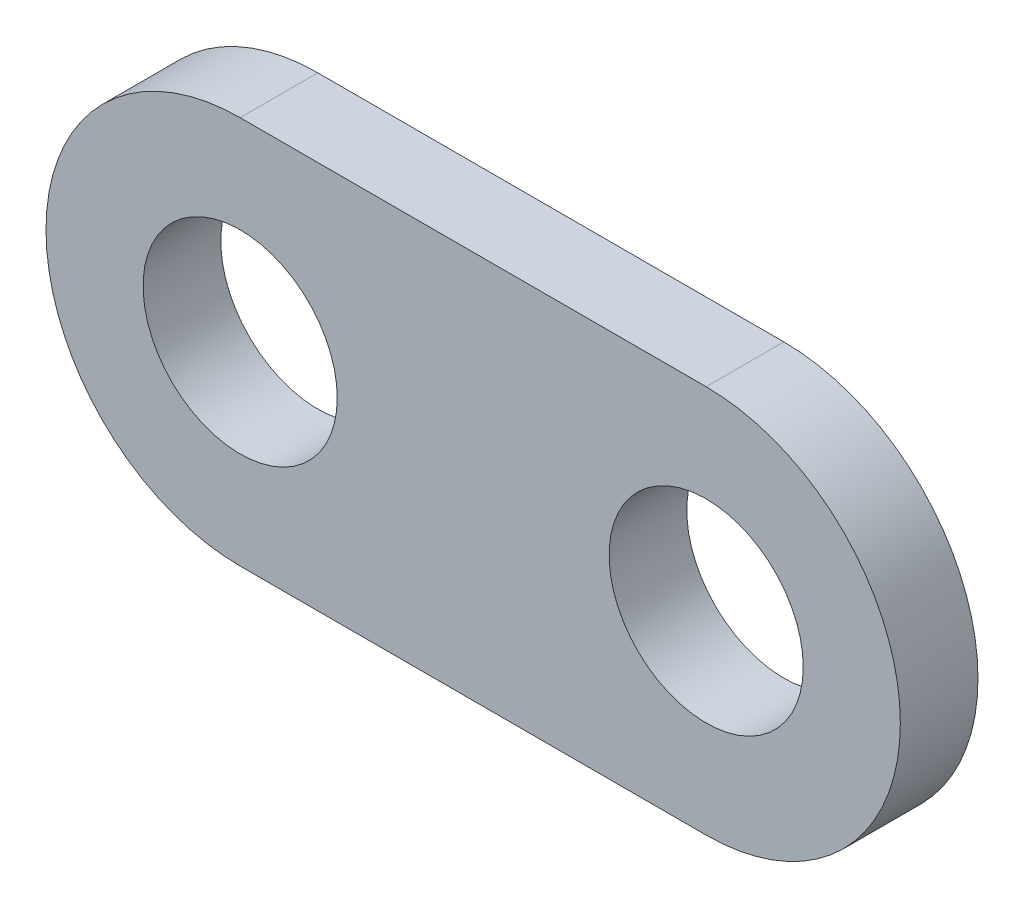
ISO-10303-21;
HEADER;
FILE_DESCRIPTION(('STEP AP214'),'2;1');
FILE_NAME('part.step','',(''),(''),'','','');
FILE_SCHEMA(('AUTOMOTIVE_DESIGN { 1 0 10303 214 1 1 1 1 }'));
ENDSEC;
DATA;
#1=APPLICATION_CONTEXT('core data for automotive mechanical design processes');
#2=APPLICATION_PROTOCOL_DEFINITION('international standard','automotive_design',2000,#1);
#3=PRODUCT_CONTEXT('',#1,'mechanical');
#4=PRODUCT('Part','Part','',(#3));
#5=PRODUCT_RELATED_PRODUCT_CATEGORY('part','',(#4));
#6=PRODUCT_DEFINITION_FORMATION('','',#4);
#7=PRODUCT_DEFINITION_CONTEXT('part definition',#1,'design');
#8=PRODUCT_DEFINITION('design','',#6,#7);
#9=PRODUCT_DEFINITION_SHAPE('','',#8);
#10=(LENGTH_UNIT() NAMED_UNIT(*) SI_UNIT(.MILLI.,.METRE.));
#11=(NAMED_UNIT(*) PLANE_ANGLE_UNIT() SI_UNIT($,.RADIAN.));
#12=(NAMED_UNIT(*) SI_UNIT($,.STERADIAN.) SOLID_ANGLE_UNIT());
#13=UNCERTAINTY_MEASURE_WITH_UNIT(LENGTH_MEASURE(1.E-05),#10,'distance_accuracy_value','');
#14=(GEOMETRIC_REPRESENTATION_CONTEXT(3) GLOBAL_UNCERTAINTY_ASSIGNED_CONTEXT((#13)) GLOBAL_UNIT_ASSIGNED_CONTEXT((#10,
#11,#12)) REPRESENTATION_CONTEXT('',''));
#15=CARTESIAN_POINT('',(0.,0.,0.));
#16=DIRECTION('',(0.,0.,1.));
#17=DIRECTION('',(1.,0.,0.));
#18=AXIS2_PLACEMENT_3D('',#15,#16,#17);
#19=CARTESIAN_POINT('',(0.,0.,2.));
#20=DIRECTION('',(0.,0.,1.));
#21=DIRECTION('',(1.,0.,0.));
#22=AXIS2_PLACEMENT_3D('',#19,#20,#21);
#23=PLANE('',#22);
#24=CARTESIAN_POINT('',(0.,0.,2.));
#25=DIRECTION('',(0.,0.,1.));
#26=DIRECTION('',(1.,0.,0.));
#27=AXIS2_PLACEMENT_3D('',#24,#25,#26);
#28=CIRCLE('',#27,5.);
#29=CARTESIAN_POINT('',(5.,0.,2.));
#30=VERTEX_POINT('',#29);
#31=EDGE_CURVE('E98',#30,#30,#28,.T.);
#32=ORIENTED_EDGE('',*,*,#31,.F.);
#33=EDGE_LOOP('',(#32));
#34=FACE_BOUND('',#33,.T.);
#35=CARTESIAN_POINT('',(0.,0.,2.));
#36=DIRECTION('',(0.,0.,1.));
#37=DIRECTION('',(1.,0.,0.));
#38=AXIS2_PLACEMENT_3D('',#35,#36,#37);
#39=CIRCLE('',#38,10.);
#40=CARTESIAN_POINT('',(0.,10.,2.));
#41=VERTEX_POINT('',#40);
#42=CARTESIAN_POINT('',(0.,-10.,2.));
#43=VERTEX_POINT('',#42);
#44=EDGE_CURVE('E108',#41,#43,#39,.T.);
#45=ORIENTED_EDGE('',*,*,#44,.T.);
#46=DIRECTION('',(1.,0.,0.));
#47=VECTOR('',#46,1.);
#48=CARTESIAN_POINT('',(24.,-10.,2.));
#49=LINE('',#48,#47);
#50=CARTESIAN_POINT('',(24.,-10.,2.));
#51=VERTEX_POINT('',#50);
#52=EDGE_CURVE('E93',#43,#51,#49,.T.);
#53=ORIENTED_EDGE('',*,*,#52,.T.);
#54=CARTESIAN_POINT('',(24.,0.,2.));
#55=DIRECTION('',(0.,0.,1.));
#56=DIRECTION('',(-1.,0.,0.));
#57=AXIS2_PLACEMENT_3D('',#54,#55,#56);
#58=CIRCLE('',#57,10.);
#59=CARTESIAN_POINT('',(24.,10.,2.));
#60=VERTEX_POINT('',#59);
#61=EDGE_CURVE('E59',#51,#60,#58,.T.);
#62=ORIENTED_EDGE('',*,*,#61,.T.);
#63=DIRECTION('',(-1.,0.,0.));
#64=VECTOR('',#63,1.);
#65=CARTESIAN_POINT('',(0.,10.,2.));
#66=LINE('',#65,#64);
#67=EDGE_CURVE('E54',#60,#41,#66,.T.);
#68=ORIENTED_EDGE('',*,*,#67,.T.);
#69=EDGE_LOOP('',(#45,#53,#62,#68));
#70=FACE_BOUND('',#69,.T.);
#71=CARTESIAN_POINT('',(24.,0.,2.));
#72=DIRECTION('',(0.,0.,1.));
#73=DIRECTION('',(1.,0.,0.));
#74=AXIS2_PLACEMENT_3D('',#71,#72,#73);
#75=CIRCLE('',#74,5.);
#76=CARTESIAN_POINT('',(29.,0.,2.));
#77=VERTEX_POINT('',#76);
#78=EDGE_CURVE('E126',#77,#77,#75,.T.);
#79=ORIENTED_EDGE('',*,*,#78,.F.);
#80=EDGE_LOOP('',(#79));
#81=FACE_BOUND('',#80,.T.);
#82=ADVANCED_FACE('F39',(#34,#70,#81),#23,.T.);
#83=CARTESIAN_POINT('',(0.,0.,-2.));
#84=DIRECTION('',(0.,0.,1.));
#85=DIRECTION('',(1.,0.,0.));
#86=AXIS2_PLACEMENT_3D('',#83,#84,#85);
#87=PLANE('',#86);
#88=CARTESIAN_POINT('',(0.,0.,-2.));
#89=DIRECTION('',(0.,0.,1.));
#90=DIRECTION('',(1.,0.,0.));
#91=AXIS2_PLACEMENT_3D('',#88,#89,#90);
#92=CIRCLE('',#91,5.);
#93=CARTESIAN_POINT('',(5.,0.,-2.));
#94=VERTEX_POINT('',#93);
#95=EDGE_CURVE('E101',#94,#94,#92,.T.);
#96=ORIENTED_EDGE('',*,*,#95,.T.);
#97=EDGE_LOOP('',(#96));
#98=FACE_BOUND('',#97,.T.);
#99=CARTESIAN_POINT('',(0.,0.,-2.));
#100=DIRECTION('',(0.,0.,1.));
#101=DIRECTION('',(1.,0.,0.));
#102=AXIS2_PLACEMENT_3D('',#99,#100,#101);
#103=CIRCLE('',#102,10.);
#104=CARTESIAN_POINT('',(0.,10.,-2.));
#105=VERTEX_POINT('',#104);
#106=CARTESIAN_POINT('',(0.,-10.,-2.));
#107=VERTEX_POINT('',#106);
#108=EDGE_CURVE('E85',#105,#107,#103,.T.);
#109=ORIENTED_EDGE('',*,*,#108,.F.);
#110=DIRECTION('',(-1.,0.,0.));
#111=VECTOR('',#110,1.);
#112=CARTESIAN_POINT('',(0.,10.,-2.));
#113=LINE('',#112,#111);
#114=CARTESIAN_POINT('',(24.,10.,-2.));
#115=VERTEX_POINT('',#114);
#116=EDGE_CURVE('E106',#115,#105,#113,.T.);
#117=ORIENTED_EDGE('',*,*,#116,.F.);
#118=CARTESIAN_POINT('',(24.,0.,-2.));
#119=DIRECTION('',(0.,0.,1.));
#120=DIRECTION('',(-1.,0.,0.));
#121=AXIS2_PLACEMENT_3D('',#118,#119,#120);
#122=CIRCLE('',#121,10.);
#123=CARTESIAN_POINT('',(24.,-10.,-2.));
#124=VERTEX_POINT('',#123);
#125=EDGE_CURVE('E86',#124,#115,#122,.T.);
#126=ORIENTED_EDGE('',*,*,#125,.F.);
#127=DIRECTION('',(1.,0.,0.));
#128=VECTOR('',#127,1.);
#129=CARTESIAN_POINT('',(24.,-10.,-2.));
#130=LINE('',#129,#128);
#131=EDGE_CURVE('E80',#107,#124,#130,.T.);
#132=ORIENTED_EDGE('',*,*,#131,.F.);
#133=EDGE_LOOP('',(#109,#117,#126,#132));
#134=FACE_BOUND('',#133,.T.);
#135=CARTESIAN_POINT('',(24.,0.,-2.));
#136=DIRECTION('',(0.,0.,1.));
#137=DIRECTION('',(1.,0.,0.));
#138=AXIS2_PLACEMENT_3D('',#135,#136,#137);
#139=CIRCLE('',#138,5.);
#140=CARTESIAN_POINT('',(29.,0.,-2.));
#141=VERTEX_POINT('',#140);
#142=EDGE_CURVE('E128',#141,#141,#139,.T.);
#143=ORIENTED_EDGE('',*,*,#142,.T.);
#144=EDGE_LOOP('',(#143));
#145=FACE_BOUND('',#144,.T.);
#146=ADVANCED_FACE('F81',(#98,#134,#145),#87,.F.);
#147=CARTESIAN_POINT('',(0.,0.,2.));
#148=DIRECTION('',(0.,0.,-1.));
#149=DIRECTION('',(-1.,0.,0.));
#150=AXIS2_PLACEMENT_3D('',#147,#148,#149);
#151=CYLINDRICAL_SURFACE('',#150,10.);
#152=ORIENTED_EDGE('',*,*,#108,.T.);
#153=DIRECTION('',(0.,0.,-1.));
#154=VECTOR('',#153,1.);
#155=CARTESIAN_POINT('',(0.,-10.,2.));
#156=LINE('',#155,#154);
#157=EDGE_CURVE('E11',#43,#107,#156,.T.);
#158=ORIENTED_EDGE('',*,*,#157,.F.);
#159=ORIENTED_EDGE('',*,*,#44,.F.);
#160=DIRECTION('',(0.,0.,-1.));
#161=VECTOR('',#160,1.);
#162=CARTESIAN_POINT('',(0.,10.,2.));
#163=LINE('',#162,#161);
#164=EDGE_CURVE('E97',#41,#105,#163,.T.);
#165=ORIENTED_EDGE('',*,*,#164,.T.);
#166=EDGE_LOOP('',(#152,#158,#159,#165));
#167=FACE_BOUND('',#166,.T.);
#168=ADVANCED_FACE('F41',(#167),#151,.T.);
#169=CARTESIAN_POINT('',(24.,-10.,2.));
#170=DIRECTION('',(0.,1.,0.));
#171=DIRECTION('',(-1.,0.,0.));
#172=AXIS2_PLACEMENT_3D('',#169,#170,#171);
#173=PLANE('',#172);
#174=ORIENTED_EDGE('',*,*,#131,.T.);
#175=DIRECTION('',(0.,0.,-1.));
#176=VECTOR('',#175,1.);
#177=CARTESIAN_POINT('',(24.,-10.,2.));
#178=LINE('',#177,#176);
#179=EDGE_CURVE('E47',#51,#124,#178,.T.);
#180=ORIENTED_EDGE('',*,*,#179,.F.);
#181=ORIENTED_EDGE('',*,*,#52,.F.);
#182=ORIENTED_EDGE('',*,*,#157,.T.);
#183=EDGE_LOOP('',(#174,#180,#181,#182));
#184=FACE_BOUND('',#183,.T.);
#185=ADVANCED_FACE('F92',(#184),#173,.F.);
#186=CARTESIAN_POINT('',(24.,0.,2.));
#187=DIRECTION('',(0.,0.,-1.));
#188=DIRECTION('',(-1.,0.,0.));
#189=AXIS2_PLACEMENT_3D('',#186,#187,#188);
#190=CYLINDRICAL_SURFACE('',#189,10.);
#191=ORIENTED_EDGE('',*,*,#125,.T.);
#192=DIRECTION('',(0.,0.,-1.));
#193=VECTOR('',#192,1.);
#194=CARTESIAN_POINT('',(24.,10.,2.));
#195=LINE('',#194,#193);
#196=EDGE_CURVE('E114',#60,#115,#195,.T.);
#197=ORIENTED_EDGE('',*,*,#196,.F.);
#198=ORIENTED_EDGE('',*,*,#61,.F.);
#199=ORIENTED_EDGE('',*,*,#179,.T.);
#200=EDGE_LOOP('',(#191,#197,#198,#199));
#201=FACE_BOUND('',#200,.T.);
#202=ADVANCED_FACE('F117',(#201),#190,.T.);
#203=CARTESIAN_POINT('',(0.,10.,2.));
#204=DIRECTION('',(0.,-1.,0.));
#205=DIRECTION('',(0.,0.,-1.));
#206=AXIS2_PLACEMENT_3D('',#203,#204,#205);
#207=PLANE('',#206);
#208=ORIENTED_EDGE('',*,*,#116,.T.);
#209=ORIENTED_EDGE('',*,*,#164,.F.);
#210=ORIENTED_EDGE('',*,*,#67,.F.);
#211=ORIENTED_EDGE('',*,*,#196,.T.);
#212=EDGE_LOOP('',(#208,#209,#210,#211));
#213=FACE_BOUND('',#212,.T.);
#214=ADVANCED_FACE('F119',(#213),#207,.F.);
#215=CARTESIAN_POINT('',(0.,0.,2.));
#216=DIRECTION('',(0.,0.,-1.));
#217=DIRECTION('',(-1.,0.,0.));
#218=AXIS2_PLACEMENT_3D('',#215,#216,#217);
#219=CYLINDRICAL_SURFACE('',#218,5.);
#220=ORIENTED_EDGE('',*,*,#31,.T.);
#221=EDGE_LOOP('',(#220));
#222=FACE_BOUND('',#221,.T.);
#223=ORIENTED_EDGE('',*,*,#95,.F.);
#224=EDGE_LOOP('',(#223));
#225=FACE_BOUND('',#224,.T.);
#226=ADVANCED_FACE('F137',(#222,#225),#219,.F.);
#227=CARTESIAN_POINT('',(24.,0.,2.));
#228=DIRECTION('',(0.,0.,-1.));
#229=DIRECTION('',(-1.,0.,0.));
#230=AXIS2_PLACEMENT_3D('',#227,#228,#229);
#231=CYLINDRICAL_SURFACE('',#230,5.);
#232=ORIENTED_EDGE('',*,*,#78,.T.);
#233=EDGE_LOOP('',(#232));
#234=FACE_BOUND('',#233,.T.);
#235=ORIENTED_EDGE('',*,*,#142,.F.);
#236=EDGE_LOOP('',(#235));
#237=FACE_BOUND('',#236,.T.);
#238=ADVANCED_FACE('F135',(#234,#237),#231,.F.);
#239=CLOSED_SHELL('',(#82,#146,#168,#185,#202,#214,#226,#238));
#240=MANIFOLD_SOLID_BREP('B2',#239);
#241=ADVANCED_BREP_SHAPE_REPRESENTATION('',(#18,#240),#14);
#242=SHAPE_DEFINITION_REPRESENTATION(#9,#241);
ENDSEC;
END-ISO-10303-21;
